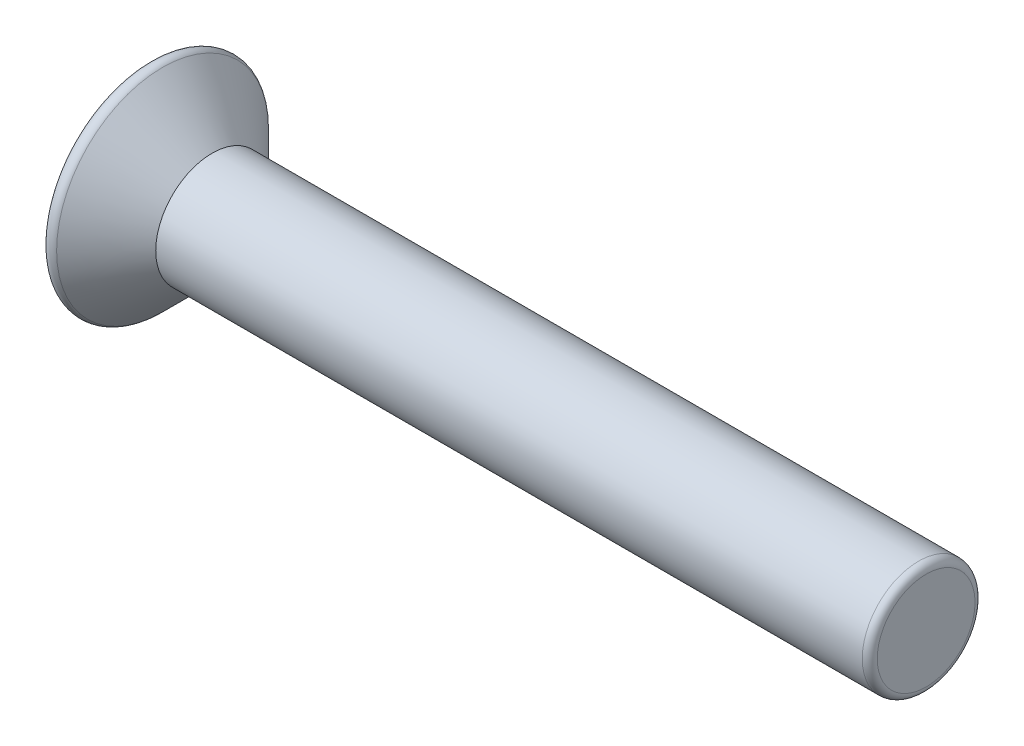
ISO-10303-21;
HEADER;
FILE_DESCRIPTION(('STEP AP214'),'2;1');
FILE_NAME('part.step','',(''),(''),'','','');
FILE_SCHEMA(('AUTOMOTIVE_DESIGN { 1 0 10303 214 1 1 1 1 }'));
ENDSEC;
DATA;
#1=APPLICATION_CONTEXT('core data for automotive mechanical design processes');
#2=APPLICATION_PROTOCOL_DEFINITION('international standard','automotive_design',2000,#1);
#3=PRODUCT_CONTEXT('',#1,'mechanical');
#4=PRODUCT('Part','Part','',(#3));
#5=PRODUCT_RELATED_PRODUCT_CATEGORY('part','',(#4));
#6=PRODUCT_DEFINITION_FORMATION('','',#4);
#7=PRODUCT_DEFINITION_CONTEXT('part definition',#1,'design');
#8=PRODUCT_DEFINITION('design','',#6,#7);
#9=PRODUCT_DEFINITION_SHAPE('','',#8);
#10=(LENGTH_UNIT() NAMED_UNIT(*) SI_UNIT(.MILLI.,.METRE.));
#11=(NAMED_UNIT(*) PLANE_ANGLE_UNIT() SI_UNIT($,.RADIAN.));
#12=(NAMED_UNIT(*) SI_UNIT($,.STERADIAN.) SOLID_ANGLE_UNIT());
#13=UNCERTAINTY_MEASURE_WITH_UNIT(LENGTH_MEASURE(1.E-05),#10,'distance_accuracy_value','');
#14=(GEOMETRIC_REPRESENTATION_CONTEXT(3) GLOBAL_UNCERTAINTY_ASSIGNED_CONTEXT((#13)) GLOBAL_UNIT_ASSIGNED_CONTEXT((#10,
#11,#12)) REPRESENTATION_CONTEXT('',''));
#15=CARTESIAN_POINT('',(0.,0.,0.));
#16=DIRECTION('',(0.,0.,1.));
#17=DIRECTION('',(1.,0.,0.));
#18=AXIS2_PLACEMENT_3D('',#15,#16,#17);
#19=CARTESIAN_POINT('',(0.,0.,0.));
#20=DIRECTION('',(1.,0.,0.));
#21=DIRECTION('',(0.,0.,-1.));
#22=AXIS2_PLACEMENT_3D('',#19,#20,#21);
#23=PLANE('',#22);
#24=CARTESIAN_POINT('',(0.,0.,0.));
#25=DIRECTION('',(1.,0.,0.));
#26=DIRECTION('',(0.,0.,-1.));
#27=AXIS2_PLACEMENT_3D('',#24,#25,#26);
#28=CIRCLE('',#27,2.67715728752538);
#29=CARTESIAN_POINT('',(0.,0.,-2.67715728752538));
#30=VERTEX_POINT('',#29);
#31=EDGE_CURVE('E48',#30,#30,#28,.F.);
#32=ORIENTED_EDGE('',*,*,#31,.T.);
#33=EDGE_LOOP('',(#32));
#34=FACE_BOUND('',#33,.T.);
#35=DIRECTION('',(0.,0.5,0.866025403784439));
#36=VECTOR('',#35,1.);
#37=CARTESIAN_POINT('',(0.,-1.1,0.));
#38=LINE('',#37,#36);
#39=CARTESIAN_POINT('',(0.,-1.1,0.));
#40=VERTEX_POINT('',#39);
#41=CARTESIAN_POINT('',(0.,-0.55,0.952627944162882));
#42=VERTEX_POINT('',#41);
#43=EDGE_CURVE('E135',#40,#42,#38,.T.);
#44=ORIENTED_EDGE('',*,*,#43,.F.);
#45=DIRECTION('',(0.,-0.5,0.866025403784439));
#46=VECTOR('',#45,1.);
#47=CARTESIAN_POINT('',(0.,-0.55,-0.952627944162883));
#48=LINE('',#47,#46);
#49=CARTESIAN_POINT('',(0.,-0.55,-0.952627944162883));
#50=VERTEX_POINT('',#49);
#51=EDGE_CURVE('E55',#50,#40,#48,.T.);
#52=ORIENTED_EDGE('',*,*,#51,.F.);
#53=DIRECTION('',(0.,-1.,0.));
#54=VECTOR('',#53,1.);
#55=CARTESIAN_POINT('',(0.,0.55,-0.952627944162882));
#56=LINE('',#55,#54);
#57=CARTESIAN_POINT('',(0.,0.55,-0.952627944162882));
#58=VERTEX_POINT('',#57);
#59=EDGE_CURVE('E148',#58,#50,#56,.T.);
#60=ORIENTED_EDGE('',*,*,#59,.F.);
#61=DIRECTION('',(0.,-0.5,-0.866025403784439));
#62=VECTOR('',#61,1.);
#63=CARTESIAN_POINT('',(0.,1.1,0.));
#64=LINE('',#63,#62);
#65=CARTESIAN_POINT('',(0.,1.1,0.));
#66=VERTEX_POINT('',#65);
#67=EDGE_CURVE('E145',#66,#58,#64,.T.);
#68=ORIENTED_EDGE('',*,*,#67,.F.);
#69=DIRECTION('',(0.,0.5,-0.866025403784439));
#70=VECTOR('',#69,1.);
#71=CARTESIAN_POINT('',(0.,0.550000000000001,0.952627944162882));
#72=LINE('',#71,#70);
#73=CARTESIAN_POINT('',(0.,0.550000000000001,0.952627944162882));
#74=VERTEX_POINT('',#73);
#75=EDGE_CURVE('E103',#74,#66,#72,.T.);
#76=ORIENTED_EDGE('',*,*,#75,.F.);
#77=DIRECTION('',(0.,1.,0.));
#78=VECTOR('',#77,1.);
#79=CARTESIAN_POINT('',(0.,-0.55,0.952627944162882));
#80=LINE('',#79,#78);
#81=EDGE_CURVE('E139',#42,#74,#80,.T.);
#82=ORIENTED_EDGE('',*,*,#81,.F.);
#83=EDGE_LOOP('',(#44,#52,#60,#68,#76,#82));
#84=FACE_BOUND('',#83,.T.);
#85=ADVANCED_FACE('F39',(#34,#84),#23,.F.);
#86=CARTESIAN_POINT('',(1.66,0.,0.));
#87=DIRECTION('',(-1.,0.,0.));
#88=DIRECTION('',(0.,0.,1.));
#89=AXIS2_PLACEMENT_3D('',#86,#87,#88);
#90=CONICAL_SURFACE('',#89,1.49999999999998,0.785398163397453);
#91=CARTESIAN_POINT('',(0.341421356237311,0.,0.));
#92=DIRECTION('',(1.,0.,0.));
#93=DIRECTION('',(0.,0.,-1.));
#94=AXIS2_PLACEMENT_3D('',#91,#92,#93);
#95=CIRCLE('',#94,2.81857864376269);
#96=CARTESIAN_POINT('',(0.341421356237311,0.,-2.81857864376269));
#97=VERTEX_POINT('',#96);
#98=EDGE_CURVE('E11',#97,#97,#95,.T.);
#99=ORIENTED_EDGE('',*,*,#98,.T.);
#100=EDGE_LOOP('',(#99));
#101=FACE_BOUND('',#100,.T.);
#102=CARTESIAN_POINT('',(1.66,0.,0.));
#103=DIRECTION('',(-1.,0.,0.));
#104=DIRECTION('',(0.,0.,1.));
#105=AXIS2_PLACEMENT_3D('',#102,#103,#104);
#106=CIRCLE('',#105,1.49999999999998);
#107=CARTESIAN_POINT('',(1.66,0.,1.49999999999998));
#108=VERTEX_POINT('',#107);
#109=EDGE_CURVE('E154',#108,#108,#106,.T.);
#110=ORIENTED_EDGE('',*,*,#109,.T.);
#111=EDGE_LOOP('',(#110));
#112=FACE_BOUND('',#111,.T.);
#113=ADVANCED_FACE('F189',(#101,#112),#90,.T.);
#114=CARTESIAN_POINT('',(-5.76894587386338,0.,0.));
#115=DIRECTION('',(-1.,0.,0.));
#116=DIRECTION('',(0.,0.,1.));
#117=AXIS2_PLACEMENT_3D('',#114,#115,#116);
#118=CYLINDRICAL_SURFACE('',#117,1.49999999999998);
#119=CARTESIAN_POINT('',(20.46,0.,0.));
#120=DIRECTION('',(-1.,0.,0.));
#121=DIRECTION('',(0.,0.,1.));
#122=AXIS2_PLACEMENT_3D('',#119,#120,#121);
#123=CIRCLE('',#122,1.49999999999998);
#124=CARTESIAN_POINT('',(20.46,0.,1.49999999999998));
#125=VERTEX_POINT('',#124);
#126=EDGE_CURVE('E167',#125,#125,#123,.T.);
#127=ORIENTED_EDGE('',*,*,#126,.T.);
#128=EDGE_LOOP('',(#127));
#129=FACE_BOUND('',#128,.T.);
#130=ORIENTED_EDGE('',*,*,#109,.F.);
#131=EDGE_LOOP('',(#130));
#132=FACE_BOUND('',#131,.T.);
#133=ADVANCED_FACE('F194',(#129,#132),#118,.T.);
#134=CARTESIAN_POINT('',(20.66,1.49999999999998,0.));
#135=DIRECTION('',(-1.,0.,0.));
#136=DIRECTION('',(0.,0.,1.));
#137=AXIS2_PLACEMENT_3D('',#134,#135,#136);
#138=PLANE('',#137);
#139=CARTESIAN_POINT('',(20.66,0.,0.));
#140=DIRECTION('',(-1.,0.,0.));
#141=DIRECTION('',(0.,0.,1.));
#142=AXIS2_PLACEMENT_3D('',#139,#140,#141);
#143=CIRCLE('',#142,1.29999999999998);
#144=CARTESIAN_POINT('',(20.66,0.,1.29999999999998));
#145=VERTEX_POINT('',#144);
#146=EDGE_CURVE('E171',#145,#145,#143,.F.);
#147=ORIENTED_EDGE('',*,*,#146,.T.);
#148=EDGE_LOOP('',(#147));
#149=FACE_BOUND('',#148,.T.);
#150=ADVANCED_FACE('F200',(#149),#138,.F.);
#151=CARTESIAN_POINT('',(0.1,-0.55,-0.952627944162883));
#152=DIRECTION('',(0.,-0.866025403784439,-0.5));
#153=DIRECTION('',(0.,0.5,-0.866025403784439));
#154=AXIS2_PLACEMENT_3D('',#151,#152,#153);
#155=PLANE('',#154);
#156=ORIENTED_EDGE('',*,*,#51,.T.);
#157=DIRECTION('',(-1.,0.,0.));
#158=VECTOR('',#157,1.);
#159=CARTESIAN_POINT('',(0.1,-1.1,0.));
#160=LINE('',#159,#158);
#161=CARTESIAN_POINT('',(0.1,-1.1,0.));
#162=VERTEX_POINT('',#161);
#163=EDGE_CURVE('E85',#162,#40,#160,.T.);
#164=ORIENTED_EDGE('',*,*,#163,.F.);
#165=DIRECTION('',(0.,-0.5,0.866025403784439));
#166=VECTOR('',#165,1.);
#167=CARTESIAN_POINT('',(0.1,-0.55,-0.952627944162883));
#168=LINE('',#167,#166);
#169=CARTESIAN_POINT('',(0.1,-0.55,-0.952627944162883));
#170=VERTEX_POINT('',#169);
#171=EDGE_CURVE('E151',#170,#162,#168,.T.);
#172=ORIENTED_EDGE('',*,*,#171,.F.);
#173=DIRECTION('',(-1.,0.,0.));
#174=VECTOR('',#173,1.);
#175=CARTESIAN_POINT('',(0.1,-0.55,-0.952627944162883));
#176=LINE('',#175,#174);
#177=EDGE_CURVE('E63',#170,#50,#176,.T.);
#178=ORIENTED_EDGE('',*,*,#177,.T.);
#179=EDGE_LOOP('',(#156,#164,#172,#178));
#180=FACE_BOUND('',#179,.T.);
#181=ADVANCED_FACE('F204',(#180),#155,.F.);
#182=CARTESIAN_POINT('',(0.1,0.55,-0.952627944162882));
#183=DIRECTION('',(0.,0.,-1.));
#184=DIRECTION('',(0.,1.,0.));
#185=AXIS2_PLACEMENT_3D('',#182,#183,#184);
#186=PLANE('',#185);
#187=ORIENTED_EDGE('',*,*,#59,.T.);
#188=ORIENTED_EDGE('',*,*,#177,.F.);
#189=DIRECTION('',(0.,-1.,0.));
#190=VECTOR('',#189,1.);
#191=CARTESIAN_POINT('',(0.1,0.55,-0.952627944162882));
#192=LINE('',#191,#190);
#193=CARTESIAN_POINT('',(0.1,0.55,-0.952627944162882));
#194=VERTEX_POINT('',#193);
#195=EDGE_CURVE('E117',#194,#170,#192,.T.);
#196=ORIENTED_EDGE('',*,*,#195,.F.);
#197=DIRECTION('',(-1.,0.,0.));
#198=VECTOR('',#197,1.);
#199=CARTESIAN_POINT('',(0.1,0.55,-0.952627944162882));
#200=LINE('',#199,#198);
#201=EDGE_CURVE('E108',#194,#58,#200,.T.);
#202=ORIENTED_EDGE('',*,*,#201,.T.);
#203=EDGE_LOOP('',(#187,#188,#196,#202));
#204=FACE_BOUND('',#203,.T.);
#205=ADVANCED_FACE('F208',(#204),#186,.F.);
#206=CARTESIAN_POINT('',(0.1,1.1,0.));
#207=DIRECTION('',(0.,0.866025403784439,-0.5));
#208=DIRECTION('',(0.,0.5,0.866025403784439));
#209=AXIS2_PLACEMENT_3D('',#206,#207,#208);
#210=PLANE('',#209);
#211=ORIENTED_EDGE('',*,*,#67,.T.);
#212=ORIENTED_EDGE('',*,*,#201,.F.);
#213=DIRECTION('',(0.,-0.5,-0.866025403784439));
#214=VECTOR('',#213,1.);
#215=CARTESIAN_POINT('',(0.1,1.1,0.));
#216=LINE('',#215,#214);
#217=CARTESIAN_POINT('',(0.1,1.1,0.));
#218=VERTEX_POINT('',#217);
#219=EDGE_CURVE('E112',#218,#194,#216,.T.);
#220=ORIENTED_EDGE('',*,*,#219,.F.);
#221=DIRECTION('',(-1.,0.,0.));
#222=VECTOR('',#221,1.);
#223=CARTESIAN_POINT('',(0.1,1.1,0.));
#224=LINE('',#223,#222);
#225=EDGE_CURVE('E96',#218,#66,#224,.T.);
#226=ORIENTED_EDGE('',*,*,#225,.T.);
#227=EDGE_LOOP('',(#211,#212,#220,#226));
#228=FACE_BOUND('',#227,.T.);
#229=ADVANCED_FACE('F113',(#228),#210,.F.);
#230=CARTESIAN_POINT('',(0.1,0.550000000000001,0.952627944162882));
#231=DIRECTION('',(0.,0.866025403784439,0.5));
#232=DIRECTION('',(0.,-0.5,0.866025403784439));
#233=AXIS2_PLACEMENT_3D('',#230,#231,#232);
#234=PLANE('',#233);
#235=ORIENTED_EDGE('',*,*,#75,.T.);
#236=ORIENTED_EDGE('',*,*,#225,.F.);
#237=DIRECTION('',(0.,0.5,-0.866025403784439));
#238=VECTOR('',#237,1.);
#239=CARTESIAN_POINT('',(0.1,0.550000000000001,0.952627944162882));
#240=LINE('',#239,#238);
#241=CARTESIAN_POINT('',(0.1,0.550000000000001,0.952627944162882));
#242=VERTEX_POINT('',#241);
#243=EDGE_CURVE('E100',#242,#218,#240,.T.);
#244=ORIENTED_EDGE('',*,*,#243,.F.);
#245=DIRECTION('',(-1.,0.,0.));
#246=VECTOR('',#245,1.);
#247=CARTESIAN_POINT('',(0.1,0.550000000000001,0.952627944162882));
#248=LINE('',#247,#246);
#249=EDGE_CURVE('E109',#242,#74,#248,.T.);
#250=ORIENTED_EDGE('',*,*,#249,.T.);
#251=EDGE_LOOP('',(#235,#236,#244,#250));
#252=FACE_BOUND('',#251,.T.);
#253=ADVANCED_FACE('F98',(#252),#234,.F.);
#254=CARTESIAN_POINT('',(0.1,-0.55,0.952627944162882));
#255=DIRECTION('',(0.,0.,1.));
#256=DIRECTION('',(1.,0.,0.));
#257=AXIS2_PLACEMENT_3D('',#254,#255,#256);
#258=PLANE('',#257);
#259=ORIENTED_EDGE('',*,*,#81,.T.);
#260=ORIENTED_EDGE('',*,*,#249,.F.);
#261=DIRECTION('',(0.,1.,0.));
#262=VECTOR('',#261,1.);
#263=CARTESIAN_POINT('',(0.1,-0.55,0.952627944162882));
#264=LINE('',#263,#262);
#265=CARTESIAN_POINT('',(0.1,-0.55,0.952627944162882));
#266=VERTEX_POINT('',#265);
#267=EDGE_CURVE('E123',#266,#242,#264,.T.);
#268=ORIENTED_EDGE('',*,*,#267,.F.);
#269=DIRECTION('',(-1.,0.,0.));
#270=VECTOR('',#269,1.);
#271=CARTESIAN_POINT('',(0.1,-0.55,0.952627944162882));
#272=LINE('',#271,#270);
#273=EDGE_CURVE('E159',#266,#42,#272,.T.);
#274=ORIENTED_EDGE('',*,*,#273,.T.);
#275=EDGE_LOOP('',(#259,#260,#268,#274));
#276=FACE_BOUND('',#275,.T.);
#277=ADVANCED_FACE('F212',(#276),#258,.F.);
#278=CARTESIAN_POINT('',(0.1,-1.1,0.));
#279=DIRECTION('',(0.,-0.866025403784439,0.5));
#280=DIRECTION('',(0.,-0.5,-0.866025403784439));
#281=AXIS2_PLACEMENT_3D('',#278,#279,#280);
#282=PLANE('',#281);
#283=ORIENTED_EDGE('',*,*,#43,.T.);
#284=ORIENTED_EDGE('',*,*,#273,.F.);
#285=DIRECTION('',(0.,0.5,0.866025403784439));
#286=VECTOR('',#285,1.);
#287=CARTESIAN_POINT('',(0.1,-1.1,0.));
#288=LINE('',#287,#286);
#289=EDGE_CURVE('E127',#162,#266,#288,.T.);
#290=ORIENTED_EDGE('',*,*,#289,.F.);
#291=ORIENTED_EDGE('',*,*,#163,.T.);
#292=EDGE_LOOP('',(#283,#284,#290,#291));
#293=FACE_BOUND('',#292,.T.);
#294=ADVANCED_FACE('F209',(#293),#282,.F.);
#295=CARTESIAN_POINT('',(0.1,0.,0.));
#296=DIRECTION('',(-1.,0.,0.));
#297=DIRECTION('',(0.,0.,1.));
#298=AXIS2_PLACEMENT_3D('',#295,#296,#297);
#299=PLANE('',#298);
#300=ORIENTED_EDGE('',*,*,#171,.T.);
#301=ORIENTED_EDGE('',*,*,#289,.T.);
#302=ORIENTED_EDGE('',*,*,#267,.T.);
#303=ORIENTED_EDGE('',*,*,#243,.T.);
#304=ORIENTED_EDGE('',*,*,#219,.T.);
#305=ORIENTED_EDGE('',*,*,#195,.T.);
#306=EDGE_LOOP('',(#300,#301,#302,#303,#304,#305));
#307=FACE_BOUND('',#306,.T.);
#308=ADVANCED_FACE('F120',(#307),#299,.T.);
#309=CARTESIAN_POINT('',(20.46,0.,0.));
#310=DIRECTION('',(-1.,0.,0.));
#311=DIRECTION('',(0.,0.,1.));
#312=AXIS2_PLACEMENT_3D('',#309,#310,#311);
#313=TOROIDAL_SURFACE('',#312,1.29999999999998,0.2);
#314=ORIENTED_EDGE('',*,*,#146,.F.);
#315=EDGE_LOOP('',(#314));
#316=FACE_BOUND('',#315,.T.);
#317=ORIENTED_EDGE('',*,*,#126,.F.);
#318=EDGE_LOOP('',(#317));
#319=FACE_BOUND('',#318,.T.);
#320=ADVANCED_FACE('F181',(#316,#319),#313,.T.);
#321=CARTESIAN_POINT('',(0.2,0.,0.));
#322=DIRECTION('',(1.,0.,0.));
#323=DIRECTION('',(0.,0.,-1.));
#324=AXIS2_PLACEMENT_3D('',#321,#322,#323);
#325=TOROIDAL_SURFACE('',#324,2.67715728752538,0.2);
#326=ORIENTED_EDGE('',*,*,#98,.F.);
#327=EDGE_LOOP('',(#326));
#328=FACE_BOUND('',#327,.T.);
#329=ORIENTED_EDGE('',*,*,#31,.F.);
#330=EDGE_LOOP('',(#329));
#331=FACE_BOUND('',#330,.T.);
#332=ADVANCED_FACE('F41',(#328,#331),#325,.T.);
#333=CLOSED_SHELL('',(#85,#113,#133,#150,#181,#205,#229,#253,#277,#294,#308,#320,#332));
#334=MANIFOLD_SOLID_BREP('B2',#333);
#335=ADVANCED_BREP_SHAPE_REPRESENTATION('',(#18,#334),#14);
#336=SHAPE_DEFINITION_REPRESENTATION(#9,#335);
ENDSEC;
END-ISO-10303-21;
